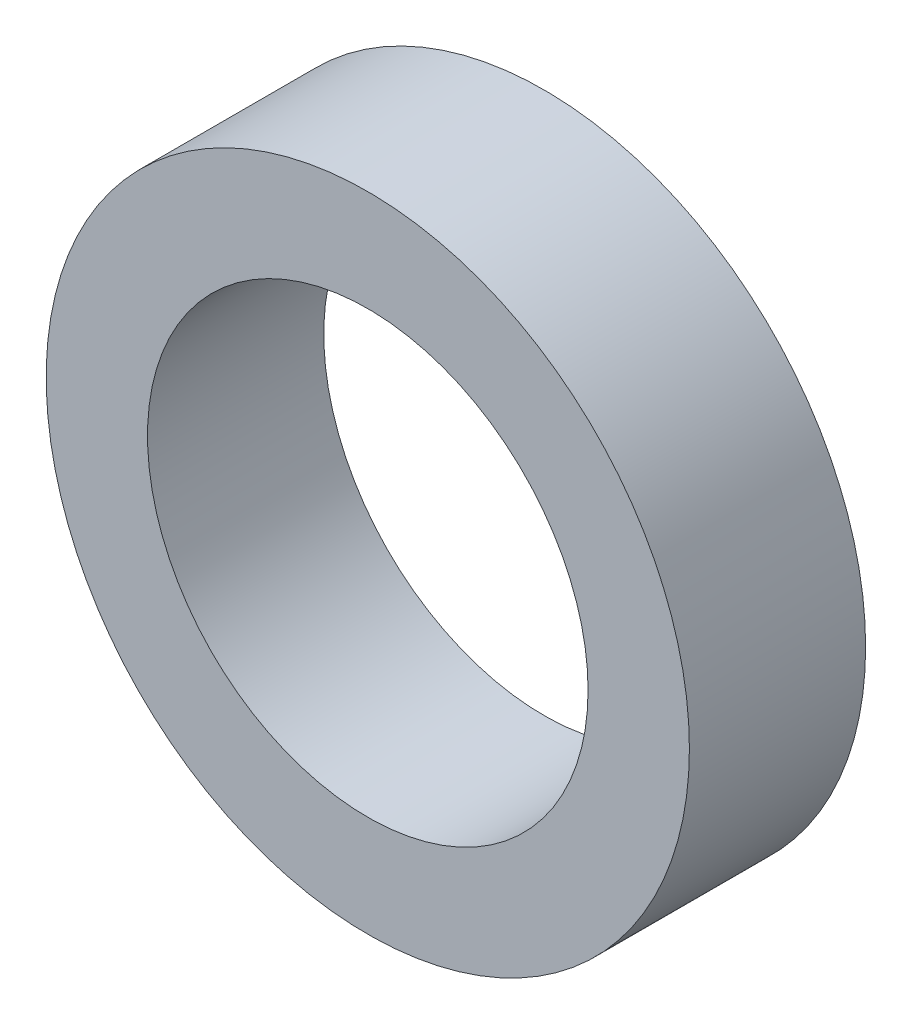
ISO-10303-21;
HEADER;
FILE_DESCRIPTION(('STEP AP214'),'2;1');
FILE_NAME('part.step','',(''),(''),'','','');
FILE_SCHEMA(('AUTOMOTIVE_DESIGN { 1 0 10303 214 1 1 1 1 }'));
ENDSEC;
DATA;
#1=APPLICATION_CONTEXT('core data for automotive mechanical design processes');
#2=APPLICATION_PROTOCOL_DEFINITION('international standard','automotive_design',2000,#1);
#3=PRODUCT_CONTEXT('',#1,'mechanical');
#4=PRODUCT('Part','Part','',(#3));
#5=PRODUCT_RELATED_PRODUCT_CATEGORY('part','',(#4));
#6=PRODUCT_DEFINITION_FORMATION('','',#4);
#7=PRODUCT_DEFINITION_CONTEXT('part definition',#1,'design');
#8=PRODUCT_DEFINITION('design','',#6,#7);
#9=PRODUCT_DEFINITION_SHAPE('','',#8);
#10=(LENGTH_UNIT() NAMED_UNIT(*) SI_UNIT(.MILLI.,.METRE.));
#11=(NAMED_UNIT(*) PLANE_ANGLE_UNIT() SI_UNIT($,.RADIAN.));
#12=(NAMED_UNIT(*) SI_UNIT($,.STERADIAN.) SOLID_ANGLE_UNIT());
#13=UNCERTAINTY_MEASURE_WITH_UNIT(LENGTH_MEASURE(1.E-05),#10,'distance_accuracy_value','');
#14=(GEOMETRIC_REPRESENTATION_CONTEXT(3) GLOBAL_UNCERTAINTY_ASSIGNED_CONTEXT((#13)) GLOBAL_UNIT_ASSIGNED_CONTEXT((#10,
#11,#12)) REPRESENTATION_CONTEXT('',''));
#15=CARTESIAN_POINT('',(0.,0.,0.));
#16=DIRECTION('',(0.,0.,1.));
#17=DIRECTION('',(1.,0.,0.));
#18=AXIS2_PLACEMENT_3D('',#15,#16,#17);
#19=CARTESIAN_POINT('',(0.,0.,0.));
#20=DIRECTION('',(0.,0.,1.));
#21=DIRECTION('',(1.,0.,0.));
#22=AXIS2_PLACEMENT_3D('',#19,#20,#21);
#23=CYLINDRICAL_SURFACE('',#22,12.5);
#24=CARTESIAN_POINT('',(0.,0.,0.));
#25=DIRECTION('',(0.,0.,1.));
#26=DIRECTION('',(1.,0.,0.));
#27=AXIS2_PLACEMENT_3D('',#24,#25,#26);
#28=CIRCLE('',#27,12.5);
#29=CARTESIAN_POINT('',(12.5,0.,0.));
#30=VERTEX_POINT('',#29);
#31=EDGE_CURVE('E27',#30,#30,#28,.T.);
#32=ORIENTED_EDGE('',*,*,#31,.F.);
#33=EDGE_LOOP('',(#32));
#34=FACE_BOUND('',#33,.T.);
#35=CARTESIAN_POINT('',(0.,0.,10.));
#36=DIRECTION('',(0.,0.,1.));
#37=DIRECTION('',(1.,0.,0.));
#38=AXIS2_PLACEMENT_3D('',#35,#36,#37);
#39=CIRCLE('',#38,12.5);
#40=CARTESIAN_POINT('',(12.5,0.,10.));
#41=VERTEX_POINT('',#40);
#42=EDGE_CURVE('E18',#41,#41,#39,.T.);
#43=ORIENTED_EDGE('',*,*,#42,.T.);
#44=EDGE_LOOP('',(#43));
#45=FACE_BOUND('',#44,.T.);
#46=ADVANCED_FACE('F15',(#34,#45),#23,.F.);
#47=CARTESIAN_POINT('',(0.,0.,10.));
#48=DIRECTION('',(0.,0.,-1.));
#49=DIRECTION('',(-1.,0.,0.));
#50=AXIS2_PLACEMENT_3D('',#47,#48,#49);
#51=PLANE('',#50);
#52=ORIENTED_EDGE('',*,*,#42,.F.);
#53=EDGE_LOOP('',(#52));
#54=FACE_BOUND('',#53,.T.);
#55=CARTESIAN_POINT('',(0.,0.,10.));
#56=DIRECTION('',(0.,0.,1.));
#57=DIRECTION('',(1.,0.,0.));
#58=AXIS2_PLACEMENT_3D('',#55,#56,#57);
#59=CIRCLE('',#58,18.25);
#60=CARTESIAN_POINT('',(18.25,0.,10.));
#61=VERTEX_POINT('',#60);
#62=EDGE_CURVE('E22',#61,#61,#59,.F.);
#63=ORIENTED_EDGE('',*,*,#62,.F.);
#64=EDGE_LOOP('',(#63));
#65=FACE_BOUND('',#64,.T.);
#66=ADVANCED_FACE('F36',(#54,#65),#51,.F.);
#67=CARTESIAN_POINT('',(0.,0.,0.));
#68=DIRECTION('',(0.,0.,-1.));
#69=DIRECTION('',(-1.,0.,0.));
#70=AXIS2_PLACEMENT_3D('',#67,#68,#69);
#71=PLANE('',#70);
#72=ORIENTED_EDGE('',*,*,#31,.T.);
#73=EDGE_LOOP('',(#72));
#74=FACE_BOUND('',#73,.T.);
#75=CARTESIAN_POINT('',(0.,0.,0.));
#76=DIRECTION('',(0.,0.,1.));
#77=DIRECTION('',(1.,0.,0.));
#78=AXIS2_PLACEMENT_3D('',#75,#76,#77);
#79=CIRCLE('',#78,18.25);
#80=CARTESIAN_POINT('',(18.25,0.,0.));
#81=VERTEX_POINT('',#80);
#82=EDGE_CURVE('E10',#81,#81,#79,.T.);
#83=ORIENTED_EDGE('',*,*,#82,.F.);
#84=EDGE_LOOP('',(#83));
#85=FACE_BOUND('',#84,.T.);
#86=ADVANCED_FACE('F39',(#74,#85),#71,.T.);
#87=CARTESIAN_POINT('',(0.,0.,0.));
#88=DIRECTION('',(0.,0.,1.));
#89=DIRECTION('',(1.,0.,0.));
#90=AXIS2_PLACEMENT_3D('',#87,#88,#89);
#91=CYLINDRICAL_SURFACE('',#90,18.25);
#92=ORIENTED_EDGE('',*,*,#82,.T.);
#93=EDGE_LOOP('',(#92));
#94=FACE_BOUND('',#93,.T.);
#95=ORIENTED_EDGE('',*,*,#62,.T.);
#96=EDGE_LOOP('',(#95));
#97=FACE_BOUND('',#96,.T.);
#98=ADVANCED_FACE('F42',(#94,#97),#91,.T.);
#99=CLOSED_SHELL('',(#46,#66,#86,#98));
#100=MANIFOLD_SOLID_BREP('B1',#99);
#101=ADVANCED_BREP_SHAPE_REPRESENTATION('',(#18,#100),#14);
#102=SHAPE_DEFINITION_REPRESENTATION(#9,#101);
ENDSEC;
END-ISO-10303-21;
